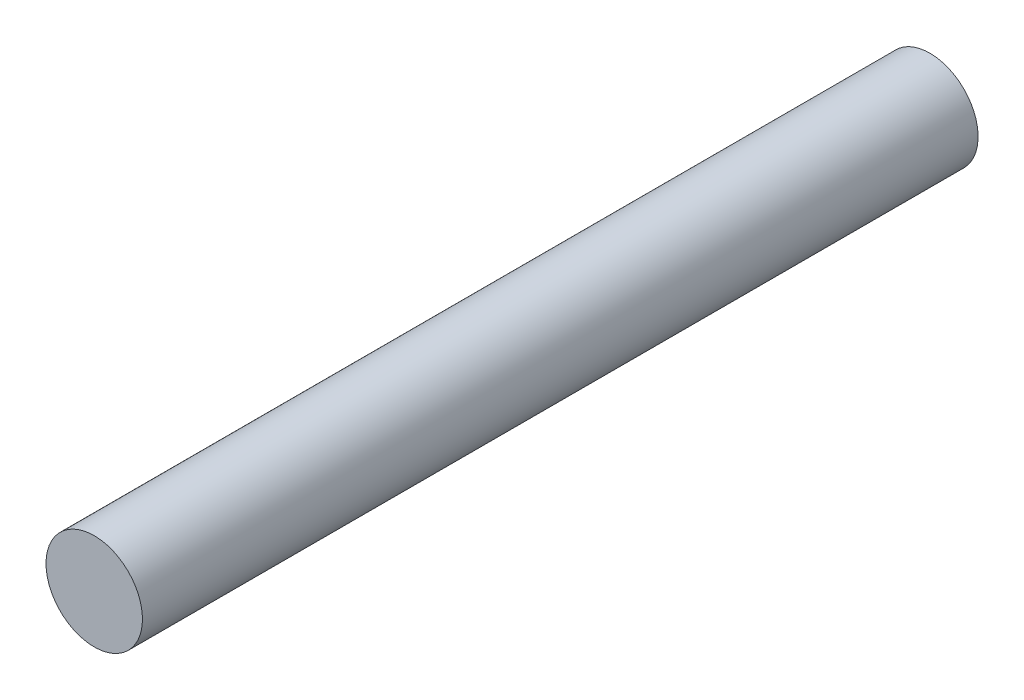
ISO-10303-21;
HEADER;
FILE_DESCRIPTION(('STEP AP214'),'2;1');
FILE_NAME('part.step','',(''),(''),'','','');
FILE_SCHEMA(('AUTOMOTIVE_DESIGN { 1 0 10303 214 1 1 1 1 }'));
ENDSEC;
DATA;
#1=APPLICATION_CONTEXT('core data for automotive mechanical design processes');
#2=APPLICATION_PROTOCOL_DEFINITION('international standard','automotive_design',2000,#1);
#3=PRODUCT_CONTEXT('',#1,'mechanical');
#4=PRODUCT('Part','Part','',(#3));
#5=PRODUCT_RELATED_PRODUCT_CATEGORY('part','',(#4));
#6=PRODUCT_DEFINITION_FORMATION('','',#4);
#7=PRODUCT_DEFINITION_CONTEXT('part definition',#1,'design');
#8=PRODUCT_DEFINITION('design','',#6,#7);
#9=PRODUCT_DEFINITION_SHAPE('','',#8);
#10=(LENGTH_UNIT() NAMED_UNIT(*) SI_UNIT(.MILLI.,.METRE.));
#11=(NAMED_UNIT(*) PLANE_ANGLE_UNIT() SI_UNIT($,.RADIAN.));
#12=(NAMED_UNIT(*) SI_UNIT($,.STERADIAN.) SOLID_ANGLE_UNIT());
#13=UNCERTAINTY_MEASURE_WITH_UNIT(LENGTH_MEASURE(1.E-05),#10,'distance_accuracy_value','');
#14=(GEOMETRIC_REPRESENTATION_CONTEXT(3) GLOBAL_UNCERTAINTY_ASSIGNED_CONTEXT((#13)) GLOBAL_UNIT_ASSIGNED_CONTEXT((#10,
#11,#12)) REPRESENTATION_CONTEXT('',''));
#15=CARTESIAN_POINT('',(0.,0.,0.));
#16=DIRECTION('',(0.,0.,1.));
#17=DIRECTION('',(1.,0.,0.));
#18=AXIS2_PLACEMENT_3D('',#15,#16,#17);
#19=CARTESIAN_POINT('',(0.,0.,26.));
#20=DIRECTION('',(0.,0.,-1.));
#21=DIRECTION('',(-1.,0.,0.));
#22=AXIS2_PLACEMENT_3D('',#19,#20,#21);
#23=CYLINDRICAL_SURFACE('',#22,1.5);
#24=CARTESIAN_POINT('',(0.,0.,26.));
#25=DIRECTION('',(0.,0.,1.));
#26=DIRECTION('',(1.,0.,0.));
#27=AXIS2_PLACEMENT_3D('',#24,#25,#26);
#28=CIRCLE('',#27,1.5);
#29=CARTESIAN_POINT('',(-1.5,0.,26.));
#30=VERTEX_POINT('',#29);
#31=EDGE_CURVE('E10',#30,#30,#28,.T.);
#32=CARTESIAN_POINT('',(0.,0.,0.));
#33=DIRECTION('',(0.,0.,1.));
#34=DIRECTION('',(1.,0.,0.));
#35=AXIS2_PLACEMENT_3D('',#32,#33,#34);
#36=CIRCLE('',#35,1.5);
#37=CARTESIAN_POINT('',(-1.5,0.,0.));
#38=VERTEX_POINT('',#37);
#39=EDGE_CURVE('E46',#38,#38,#36,.T.);
#40=CARTESIAN_POINT('',(-1.5,0.,26.));
#41=CARTESIAN_POINT('',(-1.5,0.,25.7291666666667));
#42=CARTESIAN_POINT('',(-1.5,0.,25.4583333333333));
#43=CARTESIAN_POINT('',(-1.5,0.,24.9166666666667));
#44=CARTESIAN_POINT('',(-1.5,0.,24.6458333333333));
#45=CARTESIAN_POINT('',(-1.5,0.,24.1041666666667));
#46=CARTESIAN_POINT('',(-1.5,0.,23.8333333333333));
#47=CARTESIAN_POINT('',(-1.5,0.,23.2916666666667));
#48=CARTESIAN_POINT('',(-1.5,0.,23.0208333333333));
#49=CARTESIAN_POINT('',(-1.5,0.,22.4791666666667));
#50=CARTESIAN_POINT('',(-1.5,0.,22.2083333333333));
#51=CARTESIAN_POINT('',(-1.5,0.,21.6666666666667));
#52=CARTESIAN_POINT('',(-1.5,0.,21.3958333333333));
#53=CARTESIAN_POINT('',(-1.5,0.,20.8541666666667));
#54=CARTESIAN_POINT('',(-1.5,0.,20.5833333333333));
#55=CARTESIAN_POINT('',(-1.5,0.,20.0416666666667));
#56=CARTESIAN_POINT('',(-1.5,0.,19.7708333333333));
#57=CARTESIAN_POINT('',(-1.5,0.,19.2291666666667));
#58=CARTESIAN_POINT('',(-1.5,0.,18.9583333333333));
#59=CARTESIAN_POINT('',(-1.5,0.,18.4166666666667));
#60=CARTESIAN_POINT('',(-1.5,0.,18.1458333333333));
#61=CARTESIAN_POINT('',(-1.5,0.,17.6041666666667));
#62=CARTESIAN_POINT('',(-1.5,0.,17.3333333333333));
#63=CARTESIAN_POINT('',(-1.5,0.,16.7916666666667));
#64=CARTESIAN_POINT('',(-1.5,0.,16.5208333333333));
#65=CARTESIAN_POINT('',(-1.5,0.,15.9791666666667));
#66=CARTESIAN_POINT('',(-1.5,0.,15.7083333333333));
#67=CARTESIAN_POINT('',(-1.5,0.,15.1666666666667));
#68=CARTESIAN_POINT('',(-1.5,0.,14.8958333333333));
#69=CARTESIAN_POINT('',(-1.5,0.,14.3541666666667));
#70=CARTESIAN_POINT('',(-1.5,0.,14.0833333333333));
#71=CARTESIAN_POINT('',(-1.5,0.,13.5416666666667));
#72=CARTESIAN_POINT('',(-1.5,0.,13.2708333333333));
#73=CARTESIAN_POINT('',(-1.5,0.,12.7291666666667));
#74=CARTESIAN_POINT('',(-1.5,0.,12.4583333333333));
#75=CARTESIAN_POINT('',(-1.5,0.,11.9166666666667));
#76=CARTESIAN_POINT('',(-1.5,0.,11.6458333333333));
#77=CARTESIAN_POINT('',(-1.5,0.,11.1041666666667));
#78=CARTESIAN_POINT('',(-1.5,0.,10.8333333333333));
#79=CARTESIAN_POINT('',(-1.5,0.,10.2916666666667));
#80=CARTESIAN_POINT('',(-1.5,0.,10.0208333333333));
#81=CARTESIAN_POINT('',(-1.5,0.,9.47916666666667));
#82=CARTESIAN_POINT('',(-1.5,0.,9.20833333333333));
#83=CARTESIAN_POINT('',(-1.5,0.,8.66666666666667));
#84=CARTESIAN_POINT('',(-1.5,0.,8.39583333333333));
#85=CARTESIAN_POINT('',(-1.5,0.,7.85416666666667));
#86=CARTESIAN_POINT('',(-1.5,0.,7.58333333333333));
#87=CARTESIAN_POINT('',(-1.5,0.,7.04166666666667));
#88=CARTESIAN_POINT('',(-1.5,0.,6.77083333333333));
#89=CARTESIAN_POINT('',(-1.5,0.,6.22916666666667));
#90=CARTESIAN_POINT('',(-1.5,0.,5.95833333333333));
#91=CARTESIAN_POINT('',(-1.5,0.,5.41666666666667));
#92=CARTESIAN_POINT('',(-1.5,0.,5.14583333333333));
#93=CARTESIAN_POINT('',(-1.5,0.,4.60416666666667));
#94=CARTESIAN_POINT('',(-1.5,0.,4.33333333333333));
#95=CARTESIAN_POINT('',(-1.5,0.,3.79166666666667));
#96=CARTESIAN_POINT('',(-1.5,0.,3.52083333333333));
#97=CARTESIAN_POINT('',(-1.5,0.,2.97916666666667));
#98=CARTESIAN_POINT('',(-1.5,0.,2.70833333333333));
#99=CARTESIAN_POINT('',(-1.5,0.,2.16666666666667));
#100=CARTESIAN_POINT('',(-1.5,0.,1.89583333333333));
#101=CARTESIAN_POINT('',(-1.5,0.,1.35416666666667));
#102=CARTESIAN_POINT('',(-1.5,0.,1.08333333333333));
#103=CARTESIAN_POINT('',(-1.5,0.,0.541666666666667));
#104=CARTESIAN_POINT('',(-1.5,0.,0.270833333333334));
#105=CARTESIAN_POINT('',(-1.5,0.,0.));
#106=B_SPLINE_CURVE_WITH_KNOTS('',3,(#40,#41,#42,#43,#44,#45,#46,#47,#48,#49,#50,#51,#52,#53,
#54,#55,#56,#57,#58,#59,#60,#61,#62,#63,#64,#65,#66,#67,#68,#69,#70,#71,#72,#73,#74,#75,#76,#77,
#78,#79,#80,#81,#82,#83,#84,#85,#86,#87,#88,#89,#90,#91,#92,#93,#94,#95,#96,#97,#98,#99,#100,
#101,#102,#103,#104,#105),.UNSPECIFIED.,.F.,.F.,(4,2,2,2,2,2,2,2,2,2,2,2,2,2,2,2,2,2,2,2,2,2,2,
2,2,2,2,2,2,2,2,2,4),(0.,0.812500000000001,1.625,2.4375,3.25,4.0625,4.875,5.6875,6.5,7.3125,
8.125,8.9375,9.75,10.5625,11.375,12.1875,13.,13.8125,14.625,15.4375,16.25,17.0625,17.875,
18.6875,19.5,20.3125,21.125,21.9375,22.75,23.5625,24.375,25.1875,26.),.UNSPECIFIED.);
#107=EDGE_CURVE('BSEAM43',#30,#38,#106,.T.);
#108=ORIENTED_EDGE('',*,*,#31,.F.);
#109=ORIENTED_EDGE('',*,*,#39,.T.);
#110=ORIENTED_EDGE('',*,*,#107,.T.);
#111=ORIENTED_EDGE('',*,*,#107,.F.);
#112=EDGE_LOOP('',(#108,#110,#109,#111));
#113=FACE_BOUND('',#112,.T.);
#114=ADVANCED_FACE('F43',(#113),#23,.T.);
#115=CARTESIAN_POINT('',(0.,0.,26.));
#116=DIRECTION('',(0.,0.,1.));
#117=DIRECTION('',(1.,0.,0.));
#118=AXIS2_PLACEMENT_3D('',#115,#116,#117);
#119=PLANE('',#118);
#120=ORIENTED_EDGE('',*,*,#31,.T.);
#121=EDGE_LOOP('',(#120));
#122=FACE_BOUND('',#121,.T.);
#123=ADVANCED_FACE('F60',(#122),#119,.T.);
#124=CARTESIAN_POINT('',(0.,0.,0.));
#125=DIRECTION('',(0.,0.,1.));
#126=DIRECTION('',(1.,0.,0.));
#127=AXIS2_PLACEMENT_3D('',#124,#125,#126);
#128=PLANE('',#127);
#129=ORIENTED_EDGE('',*,*,#39,.F.);
#130=EDGE_LOOP('',(#129));
#131=FACE_BOUND('',#130,.T.);
#132=ADVANCED_FACE('F58',(#131),#128,.F.);
#133=CLOSED_SHELL('',(#114,#123,#132));
#134=MANIFOLD_SOLID_BREP('B2',#133);
#135=ADVANCED_BREP_SHAPE_REPRESENTATION('',(#18,#134),#14);
#136=SHAPE_DEFINITION_REPRESENTATION(#9,#135);
ENDSEC;
END-ISO-10303-21;
